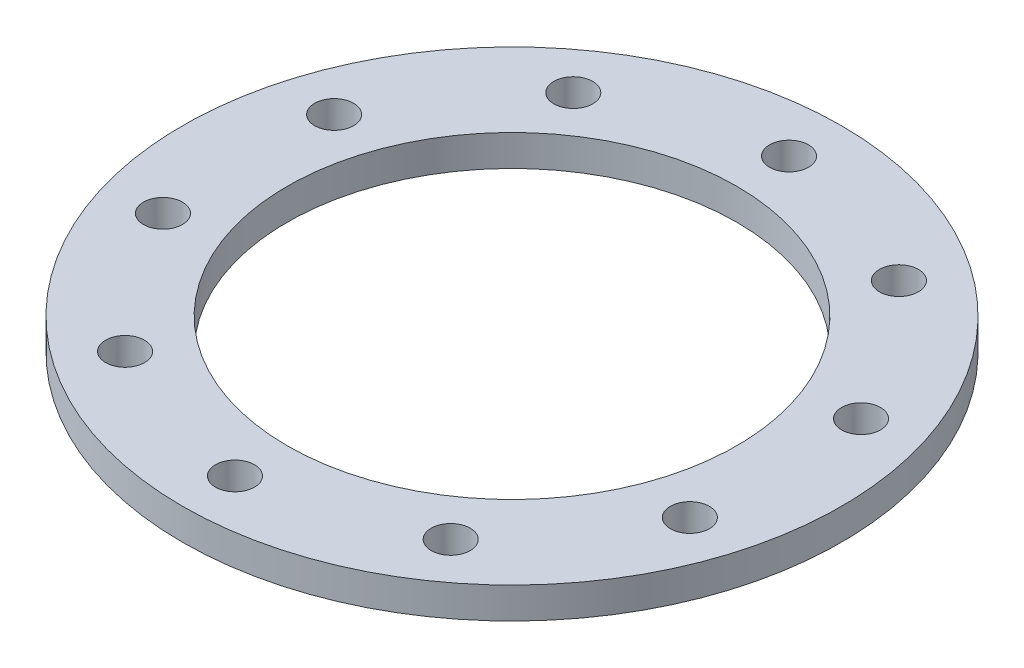
ISO-10303-21;
HEADER;
FILE_DESCRIPTION(('STEP AP214'),'2;1');
FILE_NAME('part.step','',(''),(''),'','','');
FILE_SCHEMA(('AUTOMOTIVE_DESIGN { 1 0 10303 214 1 1 1 1 }'));
ENDSEC;
DATA;
#1=APPLICATION_CONTEXT('core data for automotive mechanical design processes');
#2=APPLICATION_PROTOCOL_DEFINITION('international standard','automotive_design',2000,#1);
#3=PRODUCT_CONTEXT('',#1,'mechanical');
#4=PRODUCT('Part','Part','',(#3));
#5=PRODUCT_RELATED_PRODUCT_CATEGORY('part','',(#4));
#6=PRODUCT_DEFINITION_FORMATION('','',#4);
#7=PRODUCT_DEFINITION_CONTEXT('part definition',#1,'design');
#8=PRODUCT_DEFINITION('design','',#6,#7);
#9=PRODUCT_DEFINITION_SHAPE('','',#8);
#10=(LENGTH_UNIT() NAMED_UNIT(*) SI_UNIT(.MILLI.,.METRE.));
#11=(NAMED_UNIT(*) PLANE_ANGLE_UNIT() SI_UNIT($,.RADIAN.));
#12=(NAMED_UNIT(*) SI_UNIT($,.STERADIAN.) SOLID_ANGLE_UNIT());
#13=UNCERTAINTY_MEASURE_WITH_UNIT(LENGTH_MEASURE(1.E-05),#10,'distance_accuracy_value','');
#14=(GEOMETRIC_REPRESENTATION_CONTEXT(3) GLOBAL_UNCERTAINTY_ASSIGNED_CONTEXT((#13)) GLOBAL_UNIT_ASSIGNED_CONTEXT((#10,
#11,#12)) REPRESENTATION_CONTEXT('',''));
#15=CARTESIAN_POINT('',(0.,0.,0.));
#16=DIRECTION('',(0.,0.,1.));
#17=DIRECTION('',(1.,0.,0.));
#18=AXIS2_PLACEMENT_3D('',#15,#16,#17);
#19=CARTESIAN_POINT('',(0.,6.35,0.));
#20=DIRECTION('',(0.,1.,0.));
#21=DIRECTION('',(0.,0.,1.));
#22=AXIS2_PLACEMENT_3D('',#19,#20,#21);
#23=PLANE('',#22);
#24=CARTESIAN_POINT('',(53.6668333087867,6.35,-17.4374111764728));
#25=DIRECTION('',(0.,1.,0.));
#26=DIRECTION('',(-0.951056516295155,0.,0.309016994374945));
#27=AXIS2_PLACEMENT_3D('',#24,#25,#26);
#28=CIRCLE('',#27,3.96875);
#29=CARTESIAN_POINT('',(49.8923277597403,6.35,-16.2109999800473));
#30=VERTEX_POINT('',#29);
#31=EDGE_CURVE('E102',#30,#30,#28,.T.);
#32=ORIENTED_EDGE('',*,*,#31,.F.);
#33=EDGE_LOOP('',(#32));
#34=FACE_BOUND('',#33,.T.);
#35=CARTESIAN_POINT('',(53.6668333087866,6.35,17.4374111764732));
#36=DIRECTION('',(0.,1.,0.));
#37=DIRECTION('',(-0.951056516295152,0.,-0.309016994374952));
#38=AXIS2_PLACEMENT_3D('',#35,#36,#37);
#39=CIRCLE('',#38,3.96875);
#40=CARTESIAN_POINT('',(49.8923277597402,6.35,16.2109999800476));
#41=VERTEX_POINT('',#40);
#42=EDGE_CURVE('E96',#41,#41,#39,.T.);
#43=ORIENTED_EDGE('',*,*,#42,.F.);
#44=EDGE_LOOP('',(#43));
#45=FACE_BOUND('',#44,.T.);
#46=CARTESIAN_POINT('',(33.1679270534049,6.35,45.6517351358137));
#47=DIRECTION('',(0.,1.,0.));
#48=DIRECTION('',(-0.587785252292469,0.,-0.809016994374951));
#49=AXIS2_PLACEMENT_3D('',#46,#47,#48);
#50=CIRCLE('',#49,3.96875);
#51=CARTESIAN_POINT('',(30.8351543333691,6.35,42.4409489393882));
#52=VERTEX_POINT('',#51);
#53=EDGE_CURVE('E90',#52,#52,#50,.T.);
#54=ORIENTED_EDGE('',*,*,#53,.F.);
#55=EDGE_LOOP('',(#54));
#56=FACE_BOUND('',#55,.T.);
#57=CARTESIAN_POINT('',(0.,6.35,56.4286479186811));
#58=DIRECTION('',(0.,1.,0.));
#59=DIRECTION('',(0.,0.,-1.));
#60=AXIS2_PLACEMENT_3D('',#57,#58,#59);
#61=CIRCLE('',#60,3.96875);
#62=CARTESIAN_POINT('',(0.,6.35,52.4598979186811));
#63=VERTEX_POINT('',#62);
#64=EDGE_CURVE('E84',#63,#63,#61,.T.);
#65=ORIENTED_EDGE('',*,*,#64,.F.);
#66=EDGE_LOOP('',(#65));
#67=FACE_BOUND('',#66,.T.);
#68=CARTESIAN_POINT('',(-33.1679270534055,6.35,45.6517351358133));
#69=DIRECTION('',(0.,1.,0.));
#70=DIRECTION('',(0.58778525229248,0.,-0.809016994374942));
#71=AXIS2_PLACEMENT_3D('',#68,#69,#70);
#72=CIRCLE('',#71,3.96875);
#73=CARTESIAN_POINT('',(-30.8351543333697,6.35,42.4409489393877));
#74=VERTEX_POINT('',#73);
#75=EDGE_CURVE('E78',#74,#74,#72,.T.);
#76=ORIENTED_EDGE('',*,*,#75,.F.);
#77=EDGE_LOOP('',(#76));
#78=FACE_BOUND('',#77,.T.);
#79=CARTESIAN_POINT('',(-53.6668333087868,6.35,17.4374111764725));
#80=DIRECTION('',(0.,1.,0.));
#81=DIRECTION('',(0.951056516295157,0.,-0.309016994374938));
#82=AXIS2_PLACEMENT_3D('',#79,#80,#81);
#83=CIRCLE('',#82,3.96875);
#84=CARTESIAN_POINT('',(-49.8923277597404,6.35,16.2109999800469));
#85=VERTEX_POINT('',#84);
#86=EDGE_CURVE('E72',#85,#85,#83,.T.);
#87=ORIENTED_EDGE('',*,*,#86,.F.);
#88=EDGE_LOOP('',(#87));
#89=FACE_BOUND('',#88,.T.);
#90=CARTESIAN_POINT('',(-53.6668333087865,6.35,-17.4374111764736));
#91=DIRECTION('',(0.,1.,0.));
#92=DIRECTION('',(0.95105651629515,0.,0.309016994374958));
#93=AXIS2_PLACEMENT_3D('',#90,#91,#92);
#94=CIRCLE('',#93,3.96875);
#95=CARTESIAN_POINT('',(-49.8923277597401,6.35,-16.210999980048));
#96=VERTEX_POINT('',#95);
#97=EDGE_CURVE('E65',#96,#96,#94,.T.);
#98=ORIENTED_EDGE('',*,*,#97,.F.);
#99=EDGE_LOOP('',(#98));
#100=FACE_BOUND('',#99,.T.);
#101=CARTESIAN_POINT('',(-33.1679270534045,6.35,-45.651735135814));
#102=DIRECTION('',(0.,1.,0.));
#103=DIRECTION('',(0.587785252292462,0.,0.809016994374955));
#104=AXIS2_PLACEMENT_3D('',#101,#102,#103);
#105=CIRCLE('',#104,3.96875);
#106=CARTESIAN_POINT('',(-30.8351543333688,6.35,-42.4409489393884));
#107=VERTEX_POINT('',#106);
#108=EDGE_CURVE('E66',#107,#107,#105,.T.);
#109=ORIENTED_EDGE('',*,*,#108,.F.);
#110=EDGE_LOOP('',(#109));
#111=FACE_BOUND('',#110,.T.);
#112=CARTESIAN_POINT('',(33.1679270534052,6.35,-45.6517351358135));
#113=DIRECTION('',(0.,1.,0.));
#114=DIRECTION('',(-0.587785252292474,0.,0.809016994374947));
#115=AXIS2_PLACEMENT_3D('',#112,#113,#114);
#116=CIRCLE('',#115,3.96875);
#117=CARTESIAN_POINT('',(30.8351543333694,6.35,-42.4409489393879));
#118=VERTEX_POINT('',#117);
#119=EDGE_CURVE('E58',#118,#118,#116,.T.);
#120=ORIENTED_EDGE('',*,*,#119,.F.);
#121=EDGE_LOOP('',(#120));
#122=FACE_BOUND('',#121,.T.);
#123=CARTESIAN_POINT('',(0.,6.35,-56.4286479186811));
#124=DIRECTION('',(0.,1.,0.));
#125=DIRECTION('',(0.,0.,1.));
#126=AXIS2_PLACEMENT_3D('',#123,#124,#125);
#127=CIRCLE('',#126,3.96875);
#128=CARTESIAN_POINT('',(0.,6.35,-52.4598979186811));
#129=VERTEX_POINT('',#128);
#130=EDGE_CURVE('E52',#129,#129,#127,.T.);
#131=ORIENTED_EDGE('',*,*,#130,.F.);
#132=EDGE_LOOP('',(#131));
#133=FACE_BOUND('',#132,.T.);
#134=CARTESIAN_POINT('',(0.,6.35,0.));
#135=DIRECTION('',(0.,1.,0.));
#136=DIRECTION('',(0.,0.,1.));
#137=AXIS2_PLACEMENT_3D('',#134,#135,#136);
#138=CIRCLE('',#137,67.1331947635112);
#139=CARTESIAN_POINT('',(0.,6.35,67.1331947635112));
#140=VERTEX_POINT('',#139);
#141=EDGE_CURVE('E10',#140,#140,#138,.T.);
#142=ORIENTED_EDGE('',*,*,#141,.T.);
#143=EDGE_LOOP('',(#142));
#144=FACE_BOUND('',#143,.T.);
#145=CARTESIAN_POINT('',(0.,6.35,0.));
#146=DIRECTION('',(0.,1.,0.));
#147=DIRECTION('',(0.,0.,1.));
#148=AXIS2_PLACEMENT_3D('',#145,#146,#147);
#149=CIRCLE('',#148,45.7890196506392);
#150=CARTESIAN_POINT('',(0.,6.35,45.7890196506392));
#151=VERTEX_POINT('',#150);
#152=EDGE_CURVE('E42',#151,#151,#149,.T.);
#153=ORIENTED_EDGE('',*,*,#152,.F.);
#154=EDGE_LOOP('',(#153));
#155=FACE_BOUND('',#154,.T.);
#156=ADVANCED_FACE('F31',(#34,#45,#56,#67,#78,#89,#100,#111,#122,#133,#144,#155),#23,.T.);
#157=CARTESIAN_POINT('',(0.,0.,0.));
#158=DIRECTION('',(0.,1.,0.));
#159=DIRECTION('',(0.,0.,1.));
#160=AXIS2_PLACEMENT_3D('',#157,#158,#159);
#161=PLANE('',#160);
#162=CARTESIAN_POINT('',(53.6668333087867,0.,-17.4374111764728));
#163=DIRECTION('',(0.,1.,0.));
#164=DIRECTION('',(0.,0.,1.));
#165=AXIS2_PLACEMENT_3D('',#162,#163,#164);
#166=CIRCLE('',#165,3.96875);
#167=CARTESIAN_POINT('',(53.6668333087867,0.,-13.4686611764728));
#168=VERTEX_POINT('',#167);
#169=EDGE_CURVE('E61',#168,#168,#166,.F.);
#170=ORIENTED_EDGE('',*,*,#169,.F.);
#171=EDGE_LOOP('',(#170));
#172=FACE_BOUND('',#171,.T.);
#173=CARTESIAN_POINT('',(53.6668333087866,0.,17.4374111764732));
#174=DIRECTION('',(0.,1.,0.));
#175=DIRECTION('',(0.,0.,1.));
#176=AXIS2_PLACEMENT_3D('',#173,#174,#175);
#177=CIRCLE('',#176,3.96875);
#178=CARTESIAN_POINT('',(53.6668333087866,0.,21.4061611764732));
#179=VERTEX_POINT('',#178);
#180=EDGE_CURVE('E99',#179,#179,#177,.F.);
#181=ORIENTED_EDGE('',*,*,#180,.F.);
#182=EDGE_LOOP('',(#181));
#183=FACE_BOUND('',#182,.T.);
#184=CARTESIAN_POINT('',(33.1679270534049,0.,45.6517351358137));
#185=DIRECTION('',(0.,1.,0.));
#186=DIRECTION('',(0.,0.,1.));
#187=AXIS2_PLACEMENT_3D('',#184,#185,#186);
#188=CIRCLE('',#187,3.96875);
#189=CARTESIAN_POINT('',(33.1679270534049,0.,49.6204851358137));
#190=VERTEX_POINT('',#189);
#191=EDGE_CURVE('E93',#190,#190,#188,.F.);
#192=ORIENTED_EDGE('',*,*,#191,.F.);
#193=EDGE_LOOP('',(#192));
#194=FACE_BOUND('',#193,.T.);
#195=CARTESIAN_POINT('',(0.,0.,56.4286479186811));
#196=DIRECTION('',(0.,1.,0.));
#197=DIRECTION('',(0.,0.,1.));
#198=AXIS2_PLACEMENT_3D('',#195,#196,#197);
#199=CIRCLE('',#198,3.96875);
#200=CARTESIAN_POINT('',(0.,0.,60.3973979186811));
#201=VERTEX_POINT('',#200);
#202=EDGE_CURVE('E87',#201,#201,#199,.F.);
#203=ORIENTED_EDGE('',*,*,#202,.F.);
#204=EDGE_LOOP('',(#203));
#205=FACE_BOUND('',#204,.T.);
#206=CARTESIAN_POINT('',(-33.1679270534055,0.,45.6517351358133));
#207=DIRECTION('',(0.,1.,0.));
#208=DIRECTION('',(0.,0.,1.));
#209=AXIS2_PLACEMENT_3D('',#206,#207,#208);
#210=CIRCLE('',#209,3.96875);
#211=CARTESIAN_POINT('',(-33.1679270534055,0.,49.6204851358133));
#212=VERTEX_POINT('',#211);
#213=EDGE_CURVE('E81',#212,#212,#210,.F.);
#214=ORIENTED_EDGE('',*,*,#213,.F.);
#215=EDGE_LOOP('',(#214));
#216=FACE_BOUND('',#215,.T.);
#217=CARTESIAN_POINT('',(-53.6668333087868,0.,17.4374111764725));
#218=DIRECTION('',(0.,1.,0.));
#219=DIRECTION('',(0.,0.,1.));
#220=AXIS2_PLACEMENT_3D('',#217,#218,#219);
#221=CIRCLE('',#220,3.96875);
#222=CARTESIAN_POINT('',(-53.6668333087868,0.,21.4061611764725));
#223=VERTEX_POINT('',#222);
#224=EDGE_CURVE('E75',#223,#223,#221,.F.);
#225=ORIENTED_EDGE('',*,*,#224,.F.);
#226=EDGE_LOOP('',(#225));
#227=FACE_BOUND('',#226,.T.);
#228=CARTESIAN_POINT('',(-53.6668333087865,0.,-17.4374111764736));
#229=DIRECTION('',(0.,1.,0.));
#230=DIRECTION('',(0.,0.,1.));
#231=AXIS2_PLACEMENT_3D('',#228,#229,#230);
#232=CIRCLE('',#231,3.96875);
#233=CARTESIAN_POINT('',(-53.6668333087865,0.,-13.4686611764736));
#234=VERTEX_POINT('',#233);
#235=EDGE_CURVE('E69',#234,#234,#232,.F.);
#236=ORIENTED_EDGE('',*,*,#235,.F.);
#237=EDGE_LOOP('',(#236));
#238=FACE_BOUND('',#237,.T.);
#239=CARTESIAN_POINT('',(-33.1679270534045,0.,-45.651735135814));
#240=DIRECTION('',(0.,1.,0.));
#241=DIRECTION('',(0.,0.,1.));
#242=AXIS2_PLACEMENT_3D('',#239,#240,#241);
#243=CIRCLE('',#242,3.96875);
#244=CARTESIAN_POINT('',(-33.1679270534045,0.,-41.682985135814));
#245=VERTEX_POINT('',#244);
#246=EDGE_CURVE('E62',#245,#245,#243,.F.);
#247=ORIENTED_EDGE('',*,*,#246,.F.);
#248=EDGE_LOOP('',(#247));
#249=FACE_BOUND('',#248,.T.);
#250=CARTESIAN_POINT('',(33.1679270534052,0.,-45.6517351358135));
#251=DIRECTION('',(0.,1.,0.));
#252=DIRECTION('',(0.,0.,1.));
#253=AXIS2_PLACEMENT_3D('',#250,#251,#252);
#254=CIRCLE('',#253,3.96875);
#255=CARTESIAN_POINT('',(33.1679270534052,0.,-41.6829851358135));
#256=VERTEX_POINT('',#255);
#257=EDGE_CURVE('E55',#256,#256,#254,.F.);
#258=ORIENTED_EDGE('',*,*,#257,.F.);
#259=EDGE_LOOP('',(#258));
#260=FACE_BOUND('',#259,.T.);
#261=CARTESIAN_POINT('',(0.,0.,-56.4286479186811));
#262=DIRECTION('',(0.,1.,0.));
#263=DIRECTION('',(0.,0.,1.));
#264=AXIS2_PLACEMENT_3D('',#261,#262,#263);
#265=CIRCLE('',#264,3.96875);
#266=CARTESIAN_POINT('',(0.,0.,-52.4598979186811));
#267=VERTEX_POINT('',#266);
#268=EDGE_CURVE('E47',#267,#267,#265,.F.);
#269=ORIENTED_EDGE('',*,*,#268,.F.);
#270=EDGE_LOOP('',(#269));
#271=FACE_BOUND('',#270,.T.);
#272=CARTESIAN_POINT('',(0.,0.,0.));
#273=DIRECTION('',(0.,1.,0.));
#274=DIRECTION('',(0.,0.,1.));
#275=AXIS2_PLACEMENT_3D('',#272,#273,#274);
#276=CIRCLE('',#275,67.1331947635112);
#277=CARTESIAN_POINT('',(0.,0.,67.1331947635112));
#278=VERTEX_POINT('',#277);
#279=EDGE_CURVE('E35',#278,#278,#276,.T.);
#280=ORIENTED_EDGE('',*,*,#279,.F.);
#281=EDGE_LOOP('',(#280));
#282=FACE_BOUND('',#281,.T.);
#283=CARTESIAN_POINT('',(0.,0.,0.));
#284=DIRECTION('',(0.,1.,0.));
#285=DIRECTION('',(0.,0.,1.));
#286=AXIS2_PLACEMENT_3D('',#283,#284,#285);
#287=CIRCLE('',#286,45.7890196506392);
#288=CARTESIAN_POINT('',(0.,0.,45.7890196506392));
#289=VERTEX_POINT('',#288);
#290=EDGE_CURVE('E44',#289,#289,#287,.T.);
#291=ORIENTED_EDGE('',*,*,#290,.T.);
#292=EDGE_LOOP('',(#291));
#293=FACE_BOUND('',#292,.T.);
#294=ADVANCED_FACE('F115',(#172,#183,#194,#205,#216,#227,#238,#249,#260,#271,#282,#293),#161,.F.);
#295=CARTESIAN_POINT('',(0.,6.35,0.));
#296=DIRECTION('',(0.,-1.,0.));
#297=DIRECTION('',(0.,0.,-1.));
#298=AXIS2_PLACEMENT_3D('',#295,#296,#297);
#299=CYLINDRICAL_SURFACE('',#298,67.1331947635112);
#300=ORIENTED_EDGE('',*,*,#141,.F.);
#301=EDGE_LOOP('',(#300));
#302=FACE_BOUND('',#301,.T.);
#303=ORIENTED_EDGE('',*,*,#279,.T.);
#304=EDGE_LOOP('',(#303));
#305=FACE_BOUND('',#304,.T.);
#306=ADVANCED_FACE('F33',(#302,#305),#299,.T.);
#307=CARTESIAN_POINT('',(0.,6.35,0.));
#308=DIRECTION('',(0.,-1.,0.));
#309=DIRECTION('',(0.,0.,-1.));
#310=AXIS2_PLACEMENT_3D('',#307,#308,#309);
#311=CYLINDRICAL_SURFACE('',#310,45.7890196506392);
#312=ORIENTED_EDGE('',*,*,#152,.T.);
#313=EDGE_LOOP('',(#312));
#314=FACE_BOUND('',#313,.T.);
#315=ORIENTED_EDGE('',*,*,#290,.F.);
#316=EDGE_LOOP('',(#315));
#317=FACE_BOUND('',#316,.T.);
#318=ADVANCED_FACE('F137',(#314,#317),#311,.F.);
#319=CARTESIAN_POINT('',(0.,-0.00100000000000013,-56.4286479186811));
#320=DIRECTION('',(0.,1.,0.));
#321=DIRECTION('',(0.,0.,1.));
#322=AXIS2_PLACEMENT_3D('',#319,#320,#321);
#323=CYLINDRICAL_SURFACE('',#322,3.96875);
#324=ORIENTED_EDGE('',*,*,#130,.T.);
#325=EDGE_LOOP('',(#324));
#326=FACE_BOUND('',#325,.T.);
#327=ORIENTED_EDGE('',*,*,#268,.T.);
#328=EDGE_LOOP('',(#327));
#329=FACE_BOUND('',#328,.T.);
#330=ADVANCED_FACE('F140',(#326,#329),#323,.F.);
#331=CARTESIAN_POINT('',(33.1679270534052,-0.00100000000000013,-45.6517351358135));
#332=DIRECTION('',(0.,1.,0.));
#333=DIRECTION('',(0.,0.,1.));
#334=AXIS2_PLACEMENT_3D('',#331,#332,#333);
#335=CYLINDRICAL_SURFACE('',#334,3.96875);
#336=ORIENTED_EDGE('',*,*,#119,.T.);
#337=EDGE_LOOP('',(#336));
#338=FACE_BOUND('',#337,.T.);
#339=ORIENTED_EDGE('',*,*,#257,.T.);
#340=EDGE_LOOP('',(#339));
#341=FACE_BOUND('',#340,.T.);
#342=ADVANCED_FACE('F155',(#338,#341),#335,.F.);
#343=CARTESIAN_POINT('',(-33.1679270534045,-0.00100000000000013,-45.651735135814));
#344=DIRECTION('',(0.,1.,0.));
#345=DIRECTION('',(0.,0.,1.));
#346=AXIS2_PLACEMENT_3D('',#343,#344,#345);
#347=CYLINDRICAL_SURFACE('',#346,3.96875);
#348=ORIENTED_EDGE('',*,*,#108,.T.);
#349=EDGE_LOOP('',(#348));
#350=FACE_BOUND('',#349,.T.);
#351=ORIENTED_EDGE('',*,*,#246,.T.);
#352=EDGE_LOOP('',(#351));
#353=FACE_BOUND('',#352,.T.);
#354=ADVANCED_FACE('F159',(#350,#353),#347,.F.);
#355=CARTESIAN_POINT('',(-53.6668333087865,-0.00100000000000013,-17.4374111764736));
#356=DIRECTION('',(0.,1.,0.));
#357=DIRECTION('',(0.,0.,1.));
#358=AXIS2_PLACEMENT_3D('',#355,#356,#357);
#359=CYLINDRICAL_SURFACE('',#358,3.96875);
#360=ORIENTED_EDGE('',*,*,#97,.T.);
#361=EDGE_LOOP('',(#360));
#362=FACE_BOUND('',#361,.T.);
#363=ORIENTED_EDGE('',*,*,#235,.T.);
#364=EDGE_LOOP('',(#363));
#365=FACE_BOUND('',#364,.T.);
#366=ADVANCED_FACE('F163',(#362,#365),#359,.F.);
#367=CARTESIAN_POINT('',(-53.6668333087868,-0.00100000000000013,17.4374111764725));
#368=DIRECTION('',(0.,1.,0.));
#369=DIRECTION('',(0.,0.,1.));
#370=AXIS2_PLACEMENT_3D('',#367,#368,#369);
#371=CYLINDRICAL_SURFACE('',#370,3.96875);
#372=ORIENTED_EDGE('',*,*,#86,.T.);
#373=EDGE_LOOP('',(#372));
#374=FACE_BOUND('',#373,.T.);
#375=ORIENTED_EDGE('',*,*,#224,.T.);
#376=EDGE_LOOP('',(#375));
#377=FACE_BOUND('',#376,.T.);
#378=ADVANCED_FACE('F167',(#374,#377),#371,.F.);
#379=CARTESIAN_POINT('',(-33.1679270534055,-0.00100000000000013,45.6517351358133));
#380=DIRECTION('',(0.,1.,0.));
#381=DIRECTION('',(0.,0.,1.));
#382=AXIS2_PLACEMENT_3D('',#379,#380,#381);
#383=CYLINDRICAL_SURFACE('',#382,3.96875);
#384=ORIENTED_EDGE('',*,*,#75,.T.);
#385=EDGE_LOOP('',(#384));
#386=FACE_BOUND('',#385,.T.);
#387=ORIENTED_EDGE('',*,*,#213,.T.);
#388=EDGE_LOOP('',(#387));
#389=FACE_BOUND('',#388,.T.);
#390=ADVANCED_FACE('F171',(#386,#389),#383,.F.);
#391=CARTESIAN_POINT('',(0.,-0.00100000000000013,56.4286479186811));
#392=DIRECTION('',(0.,1.,0.));
#393=DIRECTION('',(0.,0.,1.));
#394=AXIS2_PLACEMENT_3D('',#391,#392,#393);
#395=CYLINDRICAL_SURFACE('',#394,3.96875);
#396=ORIENTED_EDGE('',*,*,#64,.T.);
#397=EDGE_LOOP('',(#396));
#398=FACE_BOUND('',#397,.T.);
#399=ORIENTED_EDGE('',*,*,#202,.T.);
#400=EDGE_LOOP('',(#399));
#401=FACE_BOUND('',#400,.T.);
#402=ADVANCED_FACE('F175',(#398,#401),#395,.F.);
#403=CARTESIAN_POINT('',(33.1679270534049,-0.00100000000000013,45.6517351358137));
#404=DIRECTION('',(0.,1.,0.));
#405=DIRECTION('',(0.,0.,1.));
#406=AXIS2_PLACEMENT_3D('',#403,#404,#405);
#407=CYLINDRICAL_SURFACE('',#406,3.96875);
#408=ORIENTED_EDGE('',*,*,#53,.T.);
#409=EDGE_LOOP('',(#408));
#410=FACE_BOUND('',#409,.T.);
#411=ORIENTED_EDGE('',*,*,#191,.T.);
#412=EDGE_LOOP('',(#411));
#413=FACE_BOUND('',#412,.T.);
#414=ADVANCED_FACE('F179',(#410,#413),#407,.F.);
#415=CARTESIAN_POINT('',(53.6668333087866,-0.00100000000000013,17.4374111764732));
#416=DIRECTION('',(0.,1.,0.));
#417=DIRECTION('',(0.,0.,1.));
#418=AXIS2_PLACEMENT_3D('',#415,#416,#417);
#419=CYLINDRICAL_SURFACE('',#418,3.96875);
#420=ORIENTED_EDGE('',*,*,#42,.T.);
#421=EDGE_LOOP('',(#420));
#422=FACE_BOUND('',#421,.T.);
#423=ORIENTED_EDGE('',*,*,#180,.T.);
#424=EDGE_LOOP('',(#423));
#425=FACE_BOUND('',#424,.T.);
#426=ADVANCED_FACE('F183',(#422,#425),#419,.F.);
#427=CARTESIAN_POINT('',(53.6668333087867,-0.00100000000000013,-17.4374111764728));
#428=DIRECTION('',(0.,1.,0.));
#429=DIRECTION('',(0.,0.,1.));
#430=AXIS2_PLACEMENT_3D('',#427,#428,#429);
#431=CYLINDRICAL_SURFACE('',#430,3.96875);
#432=ORIENTED_EDGE('',*,*,#31,.T.);
#433=EDGE_LOOP('',(#432));
#434=FACE_BOUND('',#433,.T.);
#435=ORIENTED_EDGE('',*,*,#169,.T.);
#436=EDGE_LOOP('',(#435));
#437=FACE_BOUND('',#436,.T.);
#438=ADVANCED_FACE('F110',(#434,#437),#431,.F.);
#439=CLOSED_SHELL('',(#156,#294,#306,#318,#330,#342,#354,#366,#378,#390,#402,#414,#426,#438));
#440=MANIFOLD_SOLID_BREP('B2',#439);
#441=ADVANCED_BREP_SHAPE_REPRESENTATION('',(#18,#440),#14);
#442=SHAPE_DEFINITION_REPRESENTATION(#9,#441);
ENDSEC;
END-ISO-10303-21;
